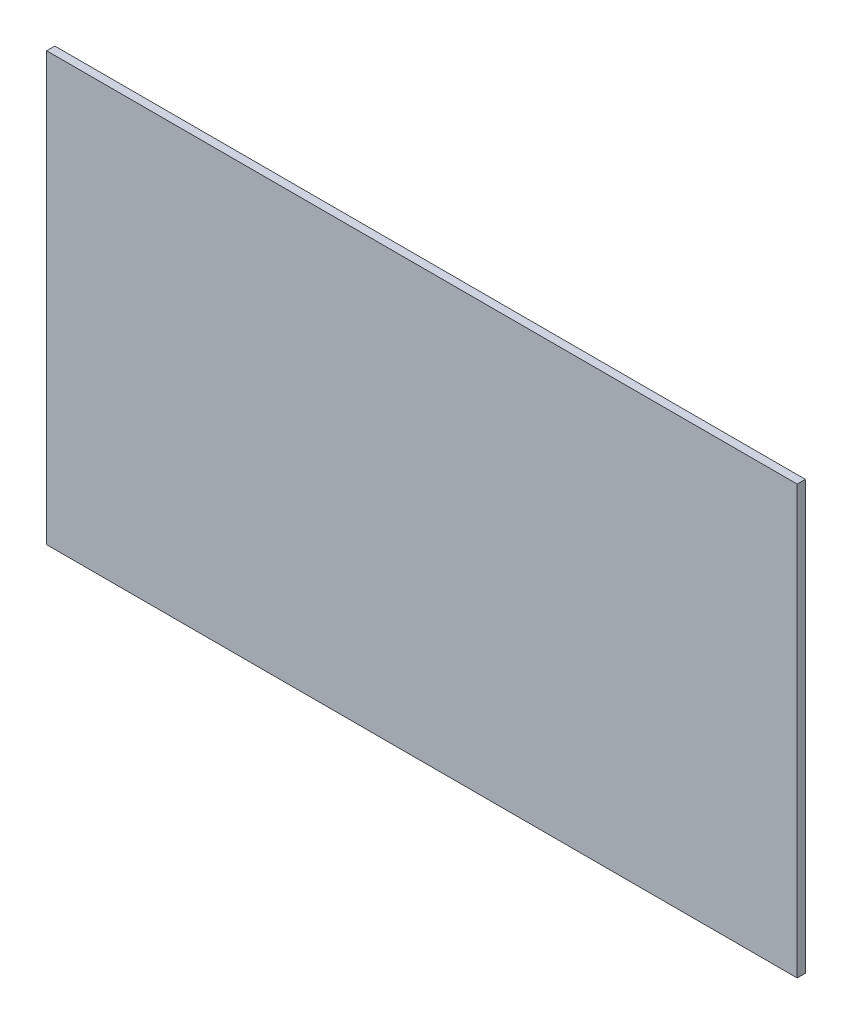
ISO-10303-21;
HEADER;
FILE_DESCRIPTION(('STEP AP214'),'2;1');
FILE_NAME('part.step','',(''),(''),'','','');
FILE_SCHEMA(('AUTOMOTIVE_DESIGN { 1 0 10303 214 1 1 1 1 }'));
ENDSEC;
DATA;
#1=APPLICATION_CONTEXT('core data for automotive mechanical design processes');
#2=APPLICATION_PROTOCOL_DEFINITION('international standard','automotive_design',2000,#1);
#3=PRODUCT_CONTEXT('',#1,'mechanical');
#4=PRODUCT('Part','Part','',(#3));
#5=PRODUCT_RELATED_PRODUCT_CATEGORY('part','',(#4));
#6=PRODUCT_DEFINITION_FORMATION('','',#4);
#7=PRODUCT_DEFINITION_CONTEXT('part definition',#1,'design');
#8=PRODUCT_DEFINITION('design','',#6,#7);
#9=PRODUCT_DEFINITION_SHAPE('','',#8);
#10=(LENGTH_UNIT() NAMED_UNIT(*) SI_UNIT(.MILLI.,.METRE.));
#11=(NAMED_UNIT(*) PLANE_ANGLE_UNIT() SI_UNIT($,.RADIAN.));
#12=(NAMED_UNIT(*) SI_UNIT($,.STERADIAN.) SOLID_ANGLE_UNIT());
#13=UNCERTAINTY_MEASURE_WITH_UNIT(LENGTH_MEASURE(1.E-05),#10,'distance_accuracy_value','');
#14=(GEOMETRIC_REPRESENTATION_CONTEXT(3) GLOBAL_UNCERTAINTY_ASSIGNED_CONTEXT((#13)) GLOBAL_UNIT_ASSIGNED_CONTEXT((#10,
#11,#12)) REPRESENTATION_CONTEXT('',''));
#15=CARTESIAN_POINT('',(0.,0.,0.));
#16=DIRECTION('',(0.,0.,1.));
#17=DIRECTION('',(1.,0.,0.));
#18=AXIS2_PLACEMENT_3D('',#15,#16,#17);
#19=CARTESIAN_POINT('',(0.,0.,1.016));
#20=DIRECTION('',(1.,0.,0.));
#21=DIRECTION('',(0.,1.,0.));
#22=AXIS2_PLACEMENT_3D('',#19,#20,#21);
#23=PLANE('',#22);
#24=DIRECTION('',(0.,-1.,0.));
#25=VECTOR('',#24,1.);
#26=CARTESIAN_POINT('',(0.,0.,0.));
#27=LINE('',#26,#25);
#28=CARTESIAN_POINT('',(0.,53.,0.));
#29=VERTEX_POINT('',#28);
#30=CARTESIAN_POINT('',(0.,0.,0.));
#31=VERTEX_POINT('',#30);
#32=EDGE_CURVE('E101',#29,#31,#27,.T.);
#33=ORIENTED_EDGE('',*,*,#32,.T.);
#34=DIRECTION('',(0.,0.,-1.));
#35=VECTOR('',#34,1.);
#36=CARTESIAN_POINT('',(0.,0.,1.016));
#37=LINE('',#36,#35);
#38=CARTESIAN_POINT('',(0.,0.,1.016));
#39=VERTEX_POINT('',#38);
#40=EDGE_CURVE('E11',#39,#31,#37,.T.);
#41=ORIENTED_EDGE('',*,*,#40,.F.);
#42=DIRECTION('',(0.,-1.,0.));
#43=VECTOR('',#42,1.);
#44=CARTESIAN_POINT('',(0.,0.,1.016));
#45=LINE('',#44,#43);
#46=CARTESIAN_POINT('',(0.,53.,1.016));
#47=VERTEX_POINT('',#46);
#48=EDGE_CURVE('E89',#47,#39,#45,.T.);
#49=ORIENTED_EDGE('',*,*,#48,.F.);
#50=DIRECTION('',(0.,0.,-1.));
#51=VECTOR('',#50,1.);
#52=CARTESIAN_POINT('',(0.,53.,1.016));
#53=LINE('',#52,#51);
#54=EDGE_CURVE('E97',#47,#29,#53,.T.);
#55=ORIENTED_EDGE('',*,*,#54,.T.);
#56=EDGE_LOOP('',(#33,#41,#49,#55));
#57=FACE_BOUND('',#56,.T.);
#58=ADVANCED_FACE('F38',(#57),#23,.F.);
#59=CARTESIAN_POINT('',(0.,0.,1.016));
#60=DIRECTION('',(0.,1.,0.));
#61=DIRECTION('',(0.,0.,1.));
#62=AXIS2_PLACEMENT_3D('',#59,#60,#61);
#63=PLANE('',#62);
#64=DIRECTION('',(1.,0.,0.));
#65=VECTOR('',#64,1.);
#66=CARTESIAN_POINT('',(0.,0.,0.));
#67=LINE('',#66,#65);
#68=CARTESIAN_POINT('',(93.,0.,0.));
#69=VERTEX_POINT('',#68);
#70=EDGE_CURVE('E93',#31,#69,#67,.T.);
#71=ORIENTED_EDGE('',*,*,#70,.T.);
#72=DIRECTION('',(0.,0.,-1.));
#73=VECTOR('',#72,1.);
#74=CARTESIAN_POINT('',(93.,0.,1.016));
#75=LINE('',#74,#73);
#76=CARTESIAN_POINT('',(93.,0.,1.016));
#77=VERTEX_POINT('',#76);
#78=EDGE_CURVE('E46',#77,#69,#75,.T.);
#79=ORIENTED_EDGE('',*,*,#78,.F.);
#80=DIRECTION('',(1.,0.,0.));
#81=VECTOR('',#80,1.);
#82=CARTESIAN_POINT('',(0.,0.,1.016));
#83=LINE('',#82,#81);
#84=EDGE_CURVE('E84',#39,#77,#83,.T.);
#85=ORIENTED_EDGE('',*,*,#84,.F.);
#86=ORIENTED_EDGE('',*,*,#40,.T.);
#87=EDGE_LOOP('',(#71,#79,#85,#86));
#88=FACE_BOUND('',#87,.T.);
#89=ADVANCED_FACE('F92',(#88),#63,.F.);
#90=CARTESIAN_POINT('',(93.,0.,1.016));
#91=DIRECTION('',(-1.,0.,0.));
#92=DIRECTION('',(0.,0.,1.));
#93=AXIS2_PLACEMENT_3D('',#90,#91,#92);
#94=PLANE('',#93);
#95=DIRECTION('',(0.,1.,0.));
#96=VECTOR('',#95,1.);
#97=CARTESIAN_POINT('',(93.,0.,0.));
#98=LINE('',#97,#96);
#99=CARTESIAN_POINT('',(93.,53.,0.));
#100=VERTEX_POINT('',#99);
#101=EDGE_CURVE('E71',#69,#100,#98,.T.);
#102=ORIENTED_EDGE('',*,*,#101,.T.);
#103=DIRECTION('',(0.,0.,-1.));
#104=VECTOR('',#103,1.);
#105=CARTESIAN_POINT('',(93.,53.,1.016));
#106=LINE('',#105,#104);
#107=CARTESIAN_POINT('',(93.,53.,1.016));
#108=VERTEX_POINT('',#107);
#109=EDGE_CURVE('E94',#108,#100,#106,.T.);
#110=ORIENTED_EDGE('',*,*,#109,.F.);
#111=DIRECTION('',(0.,1.,0.));
#112=VECTOR('',#111,1.);
#113=CARTESIAN_POINT('',(93.,0.,1.016));
#114=LINE('',#113,#112);
#115=EDGE_CURVE('E87',#77,#108,#114,.T.);
#116=ORIENTED_EDGE('',*,*,#115,.F.);
#117=ORIENTED_EDGE('',*,*,#78,.T.);
#118=EDGE_LOOP('',(#102,#110,#116,#117));
#119=FACE_BOUND('',#118,.T.);
#120=ADVANCED_FACE('F95',(#119),#94,.F.);
#121=CARTESIAN_POINT('',(0.,53.,1.016));
#122=DIRECTION('',(0.,-1.,0.));
#123=DIRECTION('',(0.,0.,-1.));
#124=AXIS2_PLACEMENT_3D('',#121,#122,#123);
#125=PLANE('',#124);
#126=DIRECTION('',(-1.,0.,0.));
#127=VECTOR('',#126,1.);
#128=CARTESIAN_POINT('',(0.,53.,0.));
#129=LINE('',#128,#127);
#130=EDGE_CURVE('E77',#100,#29,#129,.T.);
#131=ORIENTED_EDGE('',*,*,#130,.T.);
#132=ORIENTED_EDGE('',*,*,#54,.F.);
#133=DIRECTION('',(-1.,0.,0.));
#134=VECTOR('',#133,1.);
#135=CARTESIAN_POINT('',(0.,53.,1.016));
#136=LINE('',#135,#134);
#137=EDGE_CURVE('E54',#108,#47,#136,.T.);
#138=ORIENTED_EDGE('',*,*,#137,.F.);
#139=ORIENTED_EDGE('',*,*,#109,.T.);
#140=EDGE_LOOP('',(#131,#132,#138,#139));
#141=FACE_BOUND('',#140,.T.);
#142=ADVANCED_FACE('F108',(#141),#125,.F.);
#143=CARTESIAN_POINT('',(0.,0.,1.016));
#144=DIRECTION('',(0.,0.,-1.));
#145=DIRECTION('',(-1.,0.,0.));
#146=AXIS2_PLACEMENT_3D('',#143,#144,#145);
#147=PLANE('',#146);
#148=ORIENTED_EDGE('',*,*,#48,.T.);
#149=ORIENTED_EDGE('',*,*,#84,.T.);
#150=ORIENTED_EDGE('',*,*,#115,.T.);
#151=ORIENTED_EDGE('',*,*,#137,.T.);
#152=EDGE_LOOP('',(#148,#149,#150,#151));
#153=FACE_BOUND('',#152,.T.);
#154=ADVANCED_FACE('F85',(#153),#147,.F.);
#155=CARTESIAN_POINT('',(0.,0.,0.));
#156=DIRECTION('',(0.,0.,-1.));
#157=DIRECTION('',(-1.,0.,0.));
#158=AXIS2_PLACEMENT_3D('',#155,#156,#157);
#159=PLANE('',#158);
#160=ORIENTED_EDGE('',*,*,#32,.F.);
#161=ORIENTED_EDGE('',*,*,#130,.F.);
#162=ORIENTED_EDGE('',*,*,#101,.F.);
#163=ORIENTED_EDGE('',*,*,#70,.F.);
#164=EDGE_LOOP('',(#160,#161,#162,#163));
#165=FACE_BOUND('',#164,.T.);
#166=ADVANCED_FACE('F111',(#165),#159,.T.);
#167=CLOSED_SHELL('',(#58,#89,#120,#142,#154,#166));
#168=MANIFOLD_SOLID_BREP('B2',#167);
#169=ADVANCED_BREP_SHAPE_REPRESENTATION('',(#18,#168),#14);
#170=SHAPE_DEFINITION_REPRESENTATION(#9,#169);
ENDSEC;
END-ISO-10303-21;
